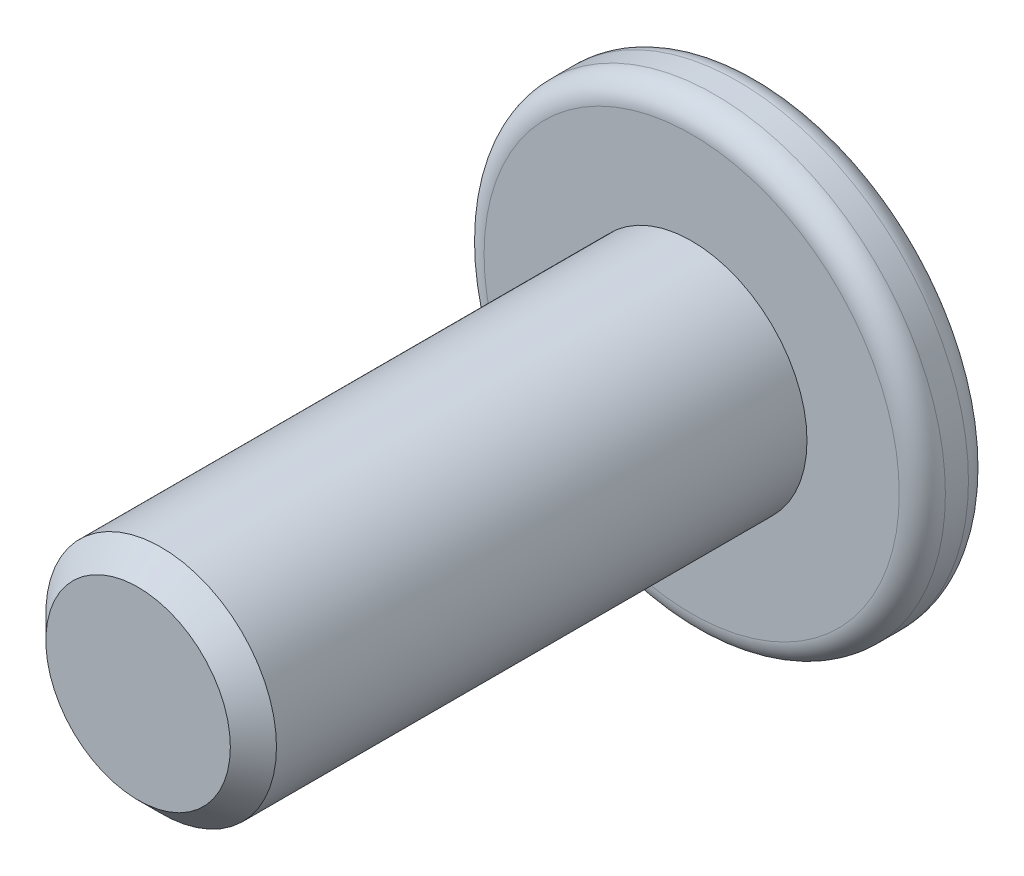
ISO-10303-21;
HEADER;
FILE_DESCRIPTION(('STEP AP214'),'2;1');
FILE_NAME('part.step','',(''),(''),'','','');
FILE_SCHEMA(('AUTOMOTIVE_DESIGN { 1 0 10303 214 1 1 1 1 }'));
ENDSEC;
DATA;
#1=APPLICATION_CONTEXT('core data for automotive mechanical design processes');
#2=APPLICATION_PROTOCOL_DEFINITION('international standard','automotive_design',2000,#1);
#3=PRODUCT_CONTEXT('',#1,'mechanical');
#4=PRODUCT('Part','Part','',(#3));
#5=PRODUCT_RELATED_PRODUCT_CATEGORY('part','',(#4));
#6=PRODUCT_DEFINITION_FORMATION('','',#4);
#7=PRODUCT_DEFINITION_CONTEXT('part definition',#1,'design');
#8=PRODUCT_DEFINITION('design','',#6,#7);
#9=PRODUCT_DEFINITION_SHAPE('','',#8);
#10=(LENGTH_UNIT() NAMED_UNIT(*) SI_UNIT(.MILLI.,.METRE.));
#11=(NAMED_UNIT(*) PLANE_ANGLE_UNIT() SI_UNIT($,.RADIAN.));
#12=(NAMED_UNIT(*) SI_UNIT($,.STERADIAN.) SOLID_ANGLE_UNIT());
#13=UNCERTAINTY_MEASURE_WITH_UNIT(LENGTH_MEASURE(1.E-05),#10,'distance_accuracy_value','');
#14=(GEOMETRIC_REPRESENTATION_CONTEXT(3) GLOBAL_UNCERTAINTY_ASSIGNED_CONTEXT((#13)) GLOBAL_UNIT_ASSIGNED_CONTEXT((#10,
#11,#12)) REPRESENTATION_CONTEXT('',''));
#15=CARTESIAN_POINT('',(0.,0.,0.));
#16=DIRECTION('',(0.,0.,1.));
#17=DIRECTION('',(1.,0.,0.));
#18=AXIS2_PLACEMENT_3D('',#15,#16,#17);
#19=CARTESIAN_POINT('',(0.,0.,0.));
#20=DIRECTION('',(0.,0.,1.));
#21=DIRECTION('',(1.,0.,0.));
#22=AXIS2_PLACEMENT_3D('',#19,#20,#21);
#23=PLANE('',#22);
#24=CARTESIAN_POINT('',(0.,0.,0.));
#25=DIRECTION('',(0.,0.,1.));
#26=DIRECTION('',(1.,0.,0.));
#27=AXIS2_PLACEMENT_3D('',#24,#25,#26);
#28=CIRCLE('',#27,9.);
#29=CARTESIAN_POINT('',(9.,0.,0.));
#30=VERTEX_POINT('',#29);
#31=EDGE_CURVE('E11',#30,#30,#28,.F.);
#32=ORIENTED_EDGE('',*,*,#31,.T.);
#33=EDGE_LOOP('',(#32));
#34=FACE_BOUND('',#33,.T.);
#35=ADVANCED_FACE('F65',(#34),#23,.F.);
#36=CARTESIAN_POINT('',(0.,0.,3.));
#37=DIRECTION('',(0.,0.,-1.));
#38=DIRECTION('',(-1.,0.,0.));
#39=AXIS2_PLACEMENT_3D('',#36,#37,#38);
#40=CYLINDRICAL_SURFACE('',#39,10.);
#41=CARTESIAN_POINT('',(0.,0.,2.));
#42=DIRECTION('',(0.,0.,1.));
#43=DIRECTION('',(1.,0.,0.));
#44=AXIS2_PLACEMENT_3D('',#41,#42,#43);
#45=CIRCLE('',#44,10.);
#46=CARTESIAN_POINT('',(10.,0.,2.));
#47=VERTEX_POINT('',#46);
#48=EDGE_CURVE('E73',#47,#47,#45,.F.);
#49=ORIENTED_EDGE('',*,*,#48,.T.);
#50=EDGE_LOOP('',(#49));
#51=FACE_BOUND('',#50,.T.);
#52=CARTESIAN_POINT('',(0.,0.,1.));
#53=DIRECTION('',(0.,0.,1.));
#54=DIRECTION('',(1.,0.,0.));
#55=AXIS2_PLACEMENT_3D('',#52,#53,#54);
#56=CIRCLE('',#55,10.);
#57=CARTESIAN_POINT('',(10.,0.,1.));
#58=VERTEX_POINT('',#57);
#59=EDGE_CURVE('E79',#58,#58,#56,.T.);
#60=ORIENTED_EDGE('',*,*,#59,.T.);
#61=EDGE_LOOP('',(#60));
#62=FACE_BOUND('',#61,.T.);
#63=ADVANCED_FACE('F119',(#51,#62),#40,.T.);
#64=CARTESIAN_POINT('',(0.,0.,3.));
#65=DIRECTION('',(0.,0.,1.));
#66=DIRECTION('',(1.,0.,0.));
#67=AXIS2_PLACEMENT_3D('',#64,#65,#66);
#68=PLANE('',#67);
#69=CARTESIAN_POINT('',(0.,0.,3.));
#70=DIRECTION('',(0.,0.,1.));
#71=DIRECTION('',(1.,0.,0.));
#72=AXIS2_PLACEMENT_3D('',#69,#70,#71);
#73=CIRCLE('',#72,9.);
#74=CARTESIAN_POINT('',(9.,0.,3.));
#75=VERTEX_POINT('',#74);
#76=EDGE_CURVE('E85',#75,#75,#73,.T.);
#77=ORIENTED_EDGE('',*,*,#76,.T.);
#78=EDGE_LOOP('',(#77));
#79=FACE_BOUND('',#78,.T.);
#80=CARTESIAN_POINT('',(0.,0.,3.));
#81=DIRECTION('',(0.,0.,1.));
#82=DIRECTION('',(1.,0.,0.));
#83=AXIS2_PLACEMENT_3D('',#80,#81,#82);
#84=CIRCLE('',#83,5.);
#85=CARTESIAN_POINT('',(5.,0.,3.));
#86=VERTEX_POINT('',#85);
#87=EDGE_CURVE('E99',#86,#86,#84,.F.);
#88=ORIENTED_EDGE('',*,*,#87,.T.);
#89=EDGE_LOOP('',(#88));
#90=FACE_BOUND('',#89,.T.);
#91=ADVANCED_FACE('F105',(#79,#90),#68,.T.);
#92=CARTESIAN_POINT('',(0.,0.,27.));
#93=DIRECTION('',(0.,0.,-1.));
#94=DIRECTION('',(-1.,0.,0.));
#95=AXIS2_PLACEMENT_3D('',#92,#93,#94);
#96=CYLINDRICAL_SURFACE('',#95,5.);
#97=CARTESIAN_POINT('',(0.,0.,26.));
#98=DIRECTION('',(0.,0.,1.));
#99=DIRECTION('',(1.,0.,0.));
#100=AXIS2_PLACEMENT_3D('',#97,#98,#99);
#101=CIRCLE('',#100,5.);
#102=CARTESIAN_POINT('',(5.,0.,26.));
#103=VERTEX_POINT('',#102);
#104=EDGE_CURVE('E91',#103,#103,#101,.F.);
#105=ORIENTED_EDGE('',*,*,#104,.T.);
#106=EDGE_LOOP('',(#105));
#107=FACE_BOUND('',#106,.T.);
#108=ORIENTED_EDGE('',*,*,#87,.F.);
#109=EDGE_LOOP('',(#108));
#110=FACE_BOUND('',#109,.T.);
#111=ADVANCED_FACE('F107',(#107,#110),#96,.T.);
#112=CARTESIAN_POINT('',(0.,0.,27.));
#113=DIRECTION('',(0.,0.,1.));
#114=DIRECTION('',(1.,0.,0.));
#115=AXIS2_PLACEMENT_3D('',#112,#113,#114);
#116=PLANE('',#115);
#117=CARTESIAN_POINT('',(0.,0.,27.));
#118=DIRECTION('',(0.,0.,1.));
#119=DIRECTION('',(1.,0.,0.));
#120=AXIS2_PLACEMENT_3D('',#117,#118,#119);
#121=CIRCLE('',#120,3.99999999999999);
#122=CARTESIAN_POINT('',(3.99999999999999,0.,27.));
#123=VERTEX_POINT('',#122);
#124=EDGE_CURVE('E95',#123,#123,#121,.T.);
#125=ORIENTED_EDGE('',*,*,#124,.T.);
#126=EDGE_LOOP('',(#125));
#127=FACE_BOUND('',#126,.T.);
#128=ADVANCED_FACE('F109',(#127),#116,.T.);
#129=CARTESIAN_POINT('',(0.,0.,27.));
#130=DIRECTION('',(0.,0.,-1.));
#131=DIRECTION('',(-1.,0.,0.));
#132=AXIS2_PLACEMENT_3D('',#129,#130,#131);
#133=CONICAL_SURFACE('',#132,3.99999999999999,0.785398163397446);
#134=ORIENTED_EDGE('',*,*,#104,.F.);
#135=EDGE_LOOP('',(#134));
#136=FACE_BOUND('',#135,.T.);
#137=ORIENTED_EDGE('',*,*,#124,.F.);
#138=EDGE_LOOP('',(#137));
#139=FACE_BOUND('',#138,.T.);
#140=ADVANCED_FACE('F115',(#136,#139),#133,.T.);
#141=CARTESIAN_POINT('',(0.,0.,2.));
#142=DIRECTION('',(0.,0.,1.));
#143=DIRECTION('',(1.,0.,0.));
#144=AXIS2_PLACEMENT_3D('',#141,#142,#143);
#145=TOROIDAL_SURFACE('',#144,9.,1.);
#146=ORIENTED_EDGE('',*,*,#48,.F.);
#147=EDGE_LOOP('',(#146));
#148=FACE_BOUND('',#147,.T.);
#149=ORIENTED_EDGE('',*,*,#76,.F.);
#150=EDGE_LOOP('',(#149));
#151=FACE_BOUND('',#150,.T.);
#152=ADVANCED_FACE('F134',(#148,#151),#145,.T.);
#153=CARTESIAN_POINT('',(0.,0.,1.));
#154=DIRECTION('',(0.,0.,1.));
#155=DIRECTION('',(1.,0.,0.));
#156=AXIS2_PLACEMENT_3D('',#153,#154,#155);
#157=TOROIDAL_SURFACE('',#156,9.,1.);
#158=ORIENTED_EDGE('',*,*,#31,.F.);
#159=EDGE_LOOP('',(#158));
#160=FACE_BOUND('',#159,.T.);
#161=ORIENTED_EDGE('',*,*,#59,.F.);
#162=EDGE_LOOP('',(#161));
#163=FACE_BOUND('',#162,.T.);
#164=ADVANCED_FACE('F67',(#160,#163),#157,.T.);
#165=CLOSED_SHELL('',(#35,#63,#91,#111,#128,#140,#152,#164));
#166=MANIFOLD_SOLID_BREP('B2',#165);
#167=ADVANCED_BREP_SHAPE_REPRESENTATION('',(#18,#166),#14);
#168=SHAPE_DEFINITION_REPRESENTATION(#9,#167);
ENDSEC;
END-ISO-10303-21;
